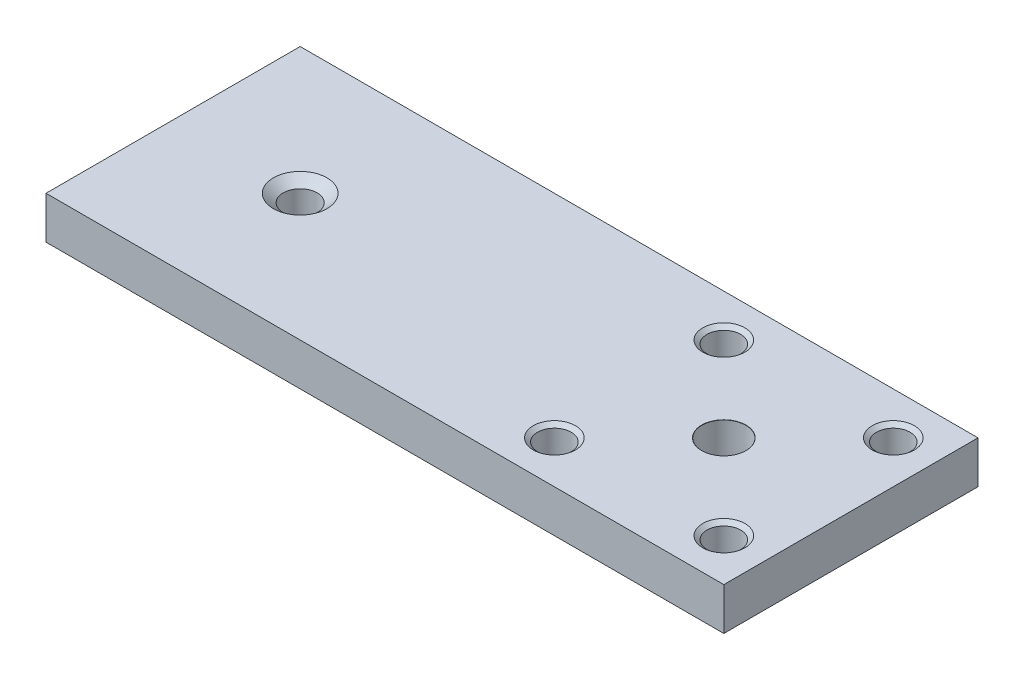
ISO-10303-21;
HEADER;
FILE_DESCRIPTION(('STEP AP214'),'2;1');
FILE_NAME('part.step','',(''),(''),'','','');
FILE_SCHEMA(('AUTOMOTIVE_DESIGN { 1 0 10303 214 1 1 1 1 }'));
ENDSEC;
DATA;
#1=APPLICATION_CONTEXT('core data for automotive mechanical design processes');
#2=APPLICATION_PROTOCOL_DEFINITION('international standard','automotive_design',2000,#1);
#3=PRODUCT_CONTEXT('',#1,'mechanical');
#4=PRODUCT('Part','Part','',(#3));
#5=PRODUCT_RELATED_PRODUCT_CATEGORY('part','',(#4));
#6=PRODUCT_DEFINITION_FORMATION('','',#4);
#7=PRODUCT_DEFINITION_CONTEXT('part definition',#1,'design');
#8=PRODUCT_DEFINITION('design','',#6,#7);
#9=PRODUCT_DEFINITION_SHAPE('','',#8);
#10=(LENGTH_UNIT() NAMED_UNIT(*) SI_UNIT(.MILLI.,.METRE.));
#11=(NAMED_UNIT(*) PLANE_ANGLE_UNIT() SI_UNIT($,.RADIAN.));
#12=(NAMED_UNIT(*) SI_UNIT($,.STERADIAN.) SOLID_ANGLE_UNIT());
#13=UNCERTAINTY_MEASURE_WITH_UNIT(LENGTH_MEASURE(1.E-05),#10,'distance_accuracy_value','');
#14=(GEOMETRIC_REPRESENTATION_CONTEXT(3) GLOBAL_UNCERTAINTY_ASSIGNED_CONTEXT((#13)) GLOBAL_UNIT_ASSIGNED_CONTEXT((#10,
#11,#12)) REPRESENTATION_CONTEXT('',''));
#15=CARTESIAN_POINT('',(0.,0.,0.));
#16=DIRECTION('',(0.,0.,1.));
#17=DIRECTION('',(1.,0.,0.));
#18=AXIS2_PLACEMENT_3D('',#15,#16,#17);
#19=CARTESIAN_POINT('',(0.,6.35,0.));
#20=DIRECTION('',(1.,0.,0.));
#21=DIRECTION('',(0.,0.,-1.));
#22=AXIS2_PLACEMENT_3D('',#19,#20,#21);
#23=PLANE('',#22);
#24=DIRECTION('',(0.,0.,1.));
#25=VECTOR('',#24,1.);
#26=CARTESIAN_POINT('',(0.,0.,0.));
#27=LINE('',#26,#25);
#28=CARTESIAN_POINT('',(0.,0.,-38.1));
#29=VERTEX_POINT('',#28);
#30=CARTESIAN_POINT('',(0.,0.,0.));
#31=VERTEX_POINT('',#30);
#32=EDGE_CURVE('E104',#29,#31,#27,.T.);
#33=ORIENTED_EDGE('',*,*,#32,.T.);
#34=DIRECTION('',(0.,-1.,0.));
#35=VECTOR('',#34,1.);
#36=CARTESIAN_POINT('',(0.,6.35,0.));
#37=LINE('',#36,#35);
#38=CARTESIAN_POINT('',(0.,6.35,0.));
#39=VERTEX_POINT('',#38);
#40=EDGE_CURVE('E11',#39,#31,#37,.T.);
#41=ORIENTED_EDGE('',*,*,#40,.F.);
#42=DIRECTION('',(0.,0.,1.));
#43=VECTOR('',#42,1.);
#44=CARTESIAN_POINT('',(0.,6.35,0.));
#45=LINE('',#44,#43);
#46=CARTESIAN_POINT('',(0.,6.35,-38.1));
#47=VERTEX_POINT('',#46);
#48=EDGE_CURVE('E92',#47,#39,#45,.T.);
#49=ORIENTED_EDGE('',*,*,#48,.F.);
#50=DIRECTION('',(0.,-1.,0.));
#51=VECTOR('',#50,1.);
#52=CARTESIAN_POINT('',(0.,6.35,-38.1));
#53=LINE('',#52,#51);
#54=EDGE_CURVE('E100',#47,#29,#53,.T.);
#55=ORIENTED_EDGE('',*,*,#54,.T.);
#56=EDGE_LOOP('',(#33,#41,#49,#55));
#57=FACE_BOUND('',#56,.T.);
#58=ADVANCED_FACE('F41',(#57),#23,.F.);
#59=CARTESIAN_POINT('',(0.,6.35,0.));
#60=DIRECTION('',(0.,0.,-1.));
#61=DIRECTION('',(-1.,0.,0.));
#62=AXIS2_PLACEMENT_3D('',#59,#60,#61);
#63=PLANE('',#62);
#64=DIRECTION('',(1.,0.,0.));
#65=VECTOR('',#64,1.);
#66=CARTESIAN_POINT('',(0.,0.,0.));
#67=LINE('',#66,#65);
#68=CARTESIAN_POINT('',(101.6,0.,0.));
#69=VERTEX_POINT('',#68);
#70=EDGE_CURVE('E96',#31,#69,#67,.T.);
#71=ORIENTED_EDGE('',*,*,#70,.T.);
#72=DIRECTION('',(0.,-1.,0.));
#73=VECTOR('',#72,1.);
#74=CARTESIAN_POINT('',(101.6,6.35,0.));
#75=LINE('',#74,#73);
#76=CARTESIAN_POINT('',(101.6,6.35,0.));
#77=VERTEX_POINT('',#76);
#78=EDGE_CURVE('E49',#77,#69,#75,.T.);
#79=ORIENTED_EDGE('',*,*,#78,.F.);
#80=DIRECTION('',(1.,0.,0.));
#81=VECTOR('',#80,1.);
#82=CARTESIAN_POINT('',(0.,6.35,0.));
#83=LINE('',#82,#81);
#84=EDGE_CURVE('E87',#39,#77,#83,.T.);
#85=ORIENTED_EDGE('',*,*,#84,.F.);
#86=ORIENTED_EDGE('',*,*,#40,.T.);
#87=EDGE_LOOP('',(#71,#79,#85,#86));
#88=FACE_BOUND('',#87,.T.);
#89=ADVANCED_FACE('F95',(#88),#63,.F.);
#90=CARTESIAN_POINT('',(101.6,6.35,0.));
#91=DIRECTION('',(-1.,0.,0.));
#92=DIRECTION('',(0.,0.,1.));
#93=AXIS2_PLACEMENT_3D('',#90,#91,#92);
#94=PLANE('',#93);
#95=DIRECTION('',(0.,0.,-1.));
#96=VECTOR('',#95,1.);
#97=CARTESIAN_POINT('',(101.6,0.,0.));
#98=LINE('',#97,#96);
#99=CARTESIAN_POINT('',(101.6,0.,-38.1));
#100=VERTEX_POINT('',#99);
#101=EDGE_CURVE('E74',#69,#100,#98,.T.);
#102=ORIENTED_EDGE('',*,*,#101,.T.);
#103=DIRECTION('',(0.,-1.,0.));
#104=VECTOR('',#103,1.);
#105=CARTESIAN_POINT('',(101.6,6.35,-38.1));
#106=LINE('',#105,#104);
#107=CARTESIAN_POINT('',(101.6,6.35,-38.1));
#108=VERTEX_POINT('',#107);
#109=EDGE_CURVE('E97',#108,#100,#106,.T.);
#110=ORIENTED_EDGE('',*,*,#109,.F.);
#111=DIRECTION('',(0.,0.,-1.));
#112=VECTOR('',#111,1.);
#113=CARTESIAN_POINT('',(101.6,6.35,0.));
#114=LINE('',#113,#112);
#115=EDGE_CURVE('E90',#77,#108,#114,.T.);
#116=ORIENTED_EDGE('',*,*,#115,.F.);
#117=ORIENTED_EDGE('',*,*,#78,.T.);
#118=EDGE_LOOP('',(#102,#110,#116,#117));
#119=FACE_BOUND('',#118,.T.);
#120=ADVANCED_FACE('F98',(#119),#94,.F.);
#121=CARTESIAN_POINT('',(0.,6.35,-38.1));
#122=DIRECTION('',(0.,0.,1.));
#123=DIRECTION('',(1.,0.,0.));
#124=AXIS2_PLACEMENT_3D('',#121,#122,#123);
#125=PLANE('',#124);
#126=DIRECTION('',(-1.,0.,0.));
#127=VECTOR('',#126,1.);
#128=CARTESIAN_POINT('',(0.,0.,-38.1));
#129=LINE('',#128,#127);
#130=EDGE_CURVE('E80',#100,#29,#129,.T.);
#131=ORIENTED_EDGE('',*,*,#130,.T.);
#132=ORIENTED_EDGE('',*,*,#54,.F.);
#133=DIRECTION('',(-1.,0.,0.));
#134=VECTOR('',#133,1.);
#135=CARTESIAN_POINT('',(0.,6.35,-38.1));
#136=LINE('',#135,#134);
#137=EDGE_CURVE('E57',#108,#47,#136,.T.);
#138=ORIENTED_EDGE('',*,*,#137,.F.);
#139=ORIENTED_EDGE('',*,*,#109,.T.);
#140=EDGE_LOOP('',(#131,#132,#138,#139));
#141=FACE_BOUND('',#140,.T.);
#142=ADVANCED_FACE('F112',(#141),#125,.F.);
#143=CARTESIAN_POINT('',(0.,6.35,0.));
#144=DIRECTION('',(0.,-1.,0.));
#145=DIRECTION('',(0.,0.,-1.));
#146=AXIS2_PLACEMENT_3D('',#143,#144,#145);
#147=PLANE('',#146);
#148=CARTESIAN_POINT('',(95.25,6.35,-31.75));
#149=DIRECTION('',(0.,1.,0.));
#150=DIRECTION('',(0.,0.,1.));
#151=AXIS2_PLACEMENT_3D('',#148,#149,#150);
#152=CIRCLE('',#151,3.16230000000001);
#153=CARTESIAN_POINT('',(95.25,6.35,-28.5877));
#154=VERTEX_POINT('',#153);
#155=EDGE_CURVE('E168',#154,#154,#152,.T.);
#156=ORIENTED_EDGE('',*,*,#155,.F.);
#157=EDGE_LOOP('',(#156));
#158=FACE_BOUND('',#157,.T.);
#159=CARTESIAN_POINT('',(69.85,6.35,-31.75));
#160=DIRECTION('',(0.,1.,0.));
#161=DIRECTION('',(0.,0.,1.));
#162=AXIS2_PLACEMENT_3D('',#159,#160,#161);
#163=CIRCLE('',#162,3.16230000000001);
#164=CARTESIAN_POINT('',(69.85,6.35,-28.5877));
#165=VERTEX_POINT('',#164);
#166=EDGE_CURVE('E159',#165,#165,#163,.T.);
#167=ORIENTED_EDGE('',*,*,#166,.F.);
#168=EDGE_LOOP('',(#167));
#169=FACE_BOUND('',#168,.T.);
#170=CARTESIAN_POINT('',(69.85,6.35,-6.35));
#171=DIRECTION('',(0.,1.,0.));
#172=DIRECTION('',(0.,0.,1.));
#173=AXIS2_PLACEMENT_3D('',#170,#171,#172);
#174=CIRCLE('',#173,3.16230000000001);
#175=CARTESIAN_POINT('',(69.85,6.35,-3.18769999999999));
#176=VERTEX_POINT('',#175);
#177=EDGE_CURVE('E150',#176,#176,#174,.T.);
#178=ORIENTED_EDGE('',*,*,#177,.F.);
#179=EDGE_LOOP('',(#178));
#180=FACE_BOUND('',#179,.T.);
#181=CARTESIAN_POINT('',(95.25,6.35,-6.35));
#182=DIRECTION('',(0.,1.,0.));
#183=DIRECTION('',(0.,0.,1.));
#184=AXIS2_PLACEMENT_3D('',#181,#182,#183);
#185=CIRCLE('',#184,3.16229999999999);
#186=CARTESIAN_POINT('',(95.25,6.35,-3.18770000000001));
#187=VERTEX_POINT('',#186);
#188=EDGE_CURVE('E141',#187,#187,#185,.T.);
#189=ORIENTED_EDGE('',*,*,#188,.F.);
#190=EDGE_LOOP('',(#189));
#191=FACE_BOUND('',#190,.T.);
#192=CARTESIAN_POINT('',(82.55,6.35,-19.05));
#193=DIRECTION('',(0.,1.,0.));
#194=DIRECTION('',(0.,0.,1.));
#195=AXIS2_PLACEMENT_3D('',#192,#193,#194);
#196=CIRCLE('',#195,3.32499999999999);
#197=CARTESIAN_POINT('',(82.55,6.35,-15.725));
#198=VERTEX_POINT('',#197);
#199=EDGE_CURVE('E132',#198,#198,#196,.T.);
#200=ORIENTED_EDGE('',*,*,#199,.F.);
#201=EDGE_LOOP('',(#200));
#202=FACE_BOUND('',#201,.T.);
#203=CARTESIAN_POINT('',(19.05,6.35,-19.05));
#204=DIRECTION('',(0.,1.,0.));
#205=DIRECTION('',(0.,0.,1.));
#206=AXIS2_PLACEMENT_3D('',#203,#204,#205);
#207=CIRCLE('',#206,4.0132);
#208=CARTESIAN_POINT('',(19.05,6.35,-15.0368));
#209=VERTEX_POINT('',#208);
#210=EDGE_CURVE('E123',#209,#209,#207,.T.);
#211=ORIENTED_EDGE('',*,*,#210,.F.);
#212=EDGE_LOOP('',(#211));
#213=FACE_BOUND('',#212,.T.);
#214=ORIENTED_EDGE('',*,*,#48,.T.);
#215=ORIENTED_EDGE('',*,*,#84,.T.);
#216=ORIENTED_EDGE('',*,*,#115,.T.);
#217=ORIENTED_EDGE('',*,*,#137,.T.);
#218=EDGE_LOOP('',(#214,#215,#216,#217));
#219=FACE_BOUND('',#218,.T.);
#220=ADVANCED_FACE('F88',(#158,#169,#180,#191,#202,#213,#219),#147,.F.);
#221=CARTESIAN_POINT('',(0.,0.,0.));
#222=DIRECTION('',(0.,-1.,0.));
#223=DIRECTION('',(0.,0.,-1.));
#224=AXIS2_PLACEMENT_3D('',#221,#222,#223);
#225=PLANE('',#224);
#226=CARTESIAN_POINT('',(95.25,0.,-31.75));
#227=DIRECTION('',(0.,1.,0.));
#228=DIRECTION('',(0.,0.,1.));
#229=AXIS2_PLACEMENT_3D('',#226,#227,#228);
#230=CIRCLE('',#229,2.5273);
#231=CARTESIAN_POINT('',(95.25,0.,-29.2227));
#232=VERTEX_POINT('',#231);
#233=EDGE_CURVE('E162',#232,#232,#230,.T.);
#234=ORIENTED_EDGE('',*,*,#233,.T.);
#235=EDGE_LOOP('',(#234));
#236=FACE_BOUND('',#235,.T.);
#237=CARTESIAN_POINT('',(69.85,0.,-31.75));
#238=DIRECTION('',(0.,1.,0.));
#239=DIRECTION('',(0.,0.,1.));
#240=AXIS2_PLACEMENT_3D('',#237,#238,#239);
#241=CIRCLE('',#240,2.5273);
#242=CARTESIAN_POINT('',(69.85,0.,-29.2227));
#243=VERTEX_POINT('',#242);
#244=EDGE_CURVE('E153',#243,#243,#241,.T.);
#245=ORIENTED_EDGE('',*,*,#244,.T.);
#246=EDGE_LOOP('',(#245));
#247=FACE_BOUND('',#246,.T.);
#248=CARTESIAN_POINT('',(69.85,0.,-6.35));
#249=DIRECTION('',(0.,1.,0.));
#250=DIRECTION('',(0.,0.,1.));
#251=AXIS2_PLACEMENT_3D('',#248,#249,#250);
#252=CIRCLE('',#251,2.5273);
#253=CARTESIAN_POINT('',(69.85,0.,-3.8227));
#254=VERTEX_POINT('',#253);
#255=EDGE_CURVE('E144',#254,#254,#252,.T.);
#256=ORIENTED_EDGE('',*,*,#255,.T.);
#257=EDGE_LOOP('',(#256));
#258=FACE_BOUND('',#257,.T.);
#259=CARTESIAN_POINT('',(95.25,0.,-6.35));
#260=DIRECTION('',(0.,1.,0.));
#261=DIRECTION('',(0.,0.,1.));
#262=AXIS2_PLACEMENT_3D('',#259,#260,#261);
#263=CIRCLE('',#262,2.5273);
#264=CARTESIAN_POINT('',(95.25,0.,-3.8227));
#265=VERTEX_POINT('',#264);
#266=EDGE_CURVE('E135',#265,#265,#263,.T.);
#267=ORIENTED_EDGE('',*,*,#266,.T.);
#268=EDGE_LOOP('',(#267));
#269=FACE_BOUND('',#268,.T.);
#270=CARTESIAN_POINT('',(82.55,0.,-19.05));
#271=DIRECTION('',(0.,1.,0.));
#272=DIRECTION('',(0.,0.,1.));
#273=AXIS2_PLACEMENT_3D('',#270,#271,#272);
#274=CIRCLE('',#273,3.3);
#275=CARTESIAN_POINT('',(82.55,0.,-15.75));
#276=VERTEX_POINT('',#275);
#277=EDGE_CURVE('E126',#276,#276,#274,.T.);
#278=ORIENTED_EDGE('',*,*,#277,.T.);
#279=EDGE_LOOP('',(#278));
#280=FACE_BOUND('',#279,.T.);
#281=CARTESIAN_POINT('',(19.05,0.,-19.05));
#282=DIRECTION('',(0.,1.,0.));
#283=DIRECTION('',(0.,0.,1.));
#284=AXIS2_PLACEMENT_3D('',#281,#282,#283);
#285=CIRCLE('',#284,2.5527);
#286=CARTESIAN_POINT('',(19.05,0.,-16.4973));
#287=VERTEX_POINT('',#286);
#288=EDGE_CURVE('E107',#287,#287,#285,.T.);
#289=ORIENTED_EDGE('',*,*,#288,.T.);
#290=EDGE_LOOP('',(#289));
#291=FACE_BOUND('',#290,.T.);
#292=ORIENTED_EDGE('',*,*,#32,.F.);
#293=ORIENTED_EDGE('',*,*,#130,.F.);
#294=ORIENTED_EDGE('',*,*,#101,.F.);
#295=ORIENTED_EDGE('',*,*,#70,.F.);
#296=EDGE_LOOP('',(#292,#293,#294,#295));
#297=FACE_BOUND('',#296,.T.);
#298=ADVANCED_FACE('F115',(#236,#247,#258,#269,#280,#291,#297),#225,.T.);
#299=CARTESIAN_POINT('',(19.05,6.35,-19.05));
#300=DIRECTION('',(0.,1.,0.));
#301=DIRECTION('',(0.,0.,1.));
#302=AXIS2_PLACEMENT_3D('',#299,#300,#301);
#303=CYLINDRICAL_SURFACE('',#302,2.5527);
#304=ORIENTED_EDGE('',*,*,#288,.F.);
#305=EDGE_LOOP('',(#304));
#306=FACE_BOUND('',#305,.T.);
#307=CARTESIAN_POINT('',(19.05,5.12449498866558,-19.05));
#308=DIRECTION('',(0.,1.,0.));
#309=DIRECTION('',(0.,0.,1.));
#310=AXIS2_PLACEMENT_3D('',#307,#308,#309);
#311=CIRCLE('',#310,2.5527);
#312=CARTESIAN_POINT('',(19.05,5.12449498866558,-16.4973));
#313=VERTEX_POINT('',#312);
#314=EDGE_CURVE('E120',#313,#313,#311,.T.);
#315=ORIENTED_EDGE('',*,*,#314,.T.);
#316=EDGE_LOOP('',(#315));
#317=FACE_BOUND('',#316,.T.);
#318=ADVANCED_FACE('F190',(#306,#317),#303,.F.);
#319=CARTESIAN_POINT('',(19.05,6.35,-19.05));
#320=DIRECTION('',(0.,1.,0.));
#321=DIRECTION('',(0.,0.,1.));
#322=AXIS2_PLACEMENT_3D('',#319,#320,#321);
#323=CONICAL_SURFACE('',#322,4.0132,0.872664625997165);
#324=ORIENTED_EDGE('',*,*,#314,.F.);
#325=EDGE_LOOP('',(#324));
#326=FACE_BOUND('',#325,.T.);
#327=ORIENTED_EDGE('',*,*,#210,.T.);
#328=EDGE_LOOP('',(#327));
#329=FACE_BOUND('',#328,.T.);
#330=ADVANCED_FACE('F187',(#326,#329),#323,.F.);
#331=CARTESIAN_POINT('',(82.55,6.35,-19.05));
#332=DIRECTION('',(0.,1.,0.));
#333=DIRECTION('',(0.,0.,1.));
#334=AXIS2_PLACEMENT_3D('',#331,#332,#333);
#335=CYLINDRICAL_SURFACE('',#334,3.3);
#336=ORIENTED_EDGE('',*,*,#277,.F.);
#337=EDGE_LOOP('',(#336));
#338=FACE_BOUND('',#337,.T.);
#339=CARTESIAN_POINT('',(82.55,6.32902250922057,-19.05));
#340=DIRECTION('',(0.,1.,0.));
#341=DIRECTION('',(0.,0.,1.));
#342=AXIS2_PLACEMENT_3D('',#339,#340,#341);
#343=CIRCLE('',#342,3.3);
#344=CARTESIAN_POINT('',(82.55,6.32902250922057,-15.75));
#345=VERTEX_POINT('',#344);
#346=EDGE_CURVE('E129',#345,#345,#343,.T.);
#347=ORIENTED_EDGE('',*,*,#346,.T.);
#348=EDGE_LOOP('',(#347));
#349=FACE_BOUND('',#348,.T.);
#350=ADVANCED_FACE('F189',(#338,#349),#335,.F.);
#351=CARTESIAN_POINT('',(82.55,6.35,-19.05));
#352=DIRECTION('',(0.,1.,0.));
#353=DIRECTION('',(0.,0.,1.));
#354=AXIS2_PLACEMENT_3D('',#351,#352,#353);
#355=CONICAL_SURFACE('',#354,3.32499999999999,0.87266462599709);
#356=ORIENTED_EDGE('',*,*,#346,.F.);
#357=EDGE_LOOP('',(#356));
#358=FACE_BOUND('',#357,.T.);
#359=ORIENTED_EDGE('',*,*,#199,.T.);
#360=EDGE_LOOP('',(#359));
#361=FACE_BOUND('',#360,.T.);
#362=ADVANCED_FACE('F197',(#358,#361),#355,.F.);
#363=CARTESIAN_POINT('',(95.25,6.35,-6.35));
#364=DIRECTION('',(0.,1.,0.));
#365=DIRECTION('',(0.,0.,1.));
#366=AXIS2_PLACEMENT_3D('',#363,#364,#365);
#367=CYLINDRICAL_SURFACE('',#366,2.5273);
#368=ORIENTED_EDGE('',*,*,#266,.F.);
#369=EDGE_LOOP('',(#368));
#370=FACE_BOUND('',#369,.T.);
#371=CARTESIAN_POINT('',(95.25,5.81717173420243,-6.35));
#372=DIRECTION('',(0.,1.,0.));
#373=DIRECTION('',(0.,0.,1.));
#374=AXIS2_PLACEMENT_3D('',#371,#372,#373);
#375=CIRCLE('',#374,2.5273);
#376=CARTESIAN_POINT('',(95.25,5.81717173420243,-3.8227));
#377=VERTEX_POINT('',#376);
#378=EDGE_CURVE('E138',#377,#377,#375,.T.);
#379=ORIENTED_EDGE('',*,*,#378,.T.);
#380=EDGE_LOOP('',(#379));
#381=FACE_BOUND('',#380,.T.);
#382=ADVANCED_FACE('F235',(#370,#381),#367,.F.);
#383=CARTESIAN_POINT('',(95.25,6.35,-6.35));
#384=DIRECTION('',(0.,1.,0.));
#385=DIRECTION('',(0.,0.,1.));
#386=AXIS2_PLACEMENT_3D('',#383,#384,#385);
#387=CONICAL_SURFACE('',#386,3.16229999999999,0.872664625997163);
#388=ORIENTED_EDGE('',*,*,#378,.F.);
#389=EDGE_LOOP('',(#388));
#390=FACE_BOUND('',#389,.T.);
#391=ORIENTED_EDGE('',*,*,#188,.T.);
#392=EDGE_LOOP('',(#391));
#393=FACE_BOUND('',#392,.T.);
#394=ADVANCED_FACE('F240',(#390,#393),#387,.F.);
#395=CARTESIAN_POINT('',(69.85,6.35,-6.35));
#396=DIRECTION('',(0.,1.,0.));
#397=DIRECTION('',(0.,0.,1.));
#398=AXIS2_PLACEMENT_3D('',#395,#396,#397);
#399=CYLINDRICAL_SURFACE('',#398,2.5273);
#400=ORIENTED_EDGE('',*,*,#255,.F.);
#401=EDGE_LOOP('',(#400));
#402=FACE_BOUND('',#401,.T.);
#403=CARTESIAN_POINT('',(69.85,5.81717173420243,-6.35));
#404=DIRECTION('',(0.,1.,0.));
#405=DIRECTION('',(0.,0.,1.));
#406=AXIS2_PLACEMENT_3D('',#403,#404,#405);
#407=CIRCLE('',#406,2.5273);
#408=CARTESIAN_POINT('',(69.85,5.81717173420243,-3.8227));
#409=VERTEX_POINT('',#408);
#410=EDGE_CURVE('E147',#409,#409,#407,.T.);
#411=ORIENTED_EDGE('',*,*,#410,.T.);
#412=EDGE_LOOP('',(#411));
#413=FACE_BOUND('',#412,.T.);
#414=ADVANCED_FACE('F246',(#402,#413),#399,.F.);
#415=CARTESIAN_POINT('',(69.85,6.35,-6.35));
#416=DIRECTION('',(0.,1.,0.));
#417=DIRECTION('',(0.,0.,1.));
#418=AXIS2_PLACEMENT_3D('',#415,#416,#417);
#419=CONICAL_SURFACE('',#418,3.16230000000001,0.872664625997173);
#420=ORIENTED_EDGE('',*,*,#410,.F.);
#421=EDGE_LOOP('',(#420));
#422=FACE_BOUND('',#421,.T.);
#423=ORIENTED_EDGE('',*,*,#177,.T.);
#424=EDGE_LOOP('',(#423));
#425=FACE_BOUND('',#424,.T.);
#426=ADVANCED_FACE('F250',(#422,#425),#419,.F.);
#427=CARTESIAN_POINT('',(69.85,6.35,-31.75));
#428=DIRECTION('',(0.,1.,0.));
#429=DIRECTION('',(0.,0.,1.));
#430=AXIS2_PLACEMENT_3D('',#427,#428,#429);
#431=CYLINDRICAL_SURFACE('',#430,2.5273);
#432=ORIENTED_EDGE('',*,*,#244,.F.);
#433=EDGE_LOOP('',(#432));
#434=FACE_BOUND('',#433,.T.);
#435=CARTESIAN_POINT('',(69.85,5.81717173420243,-31.75));
#436=DIRECTION('',(0.,1.,0.));
#437=DIRECTION('',(0.,0.,1.));
#438=AXIS2_PLACEMENT_3D('',#435,#436,#437);
#439=CIRCLE('',#438,2.5273);
#440=CARTESIAN_POINT('',(69.85,5.81717173420243,-29.2227));
#441=VERTEX_POINT('',#440);
#442=EDGE_CURVE('E156',#441,#441,#439,.T.);
#443=ORIENTED_EDGE('',*,*,#442,.T.);
#444=EDGE_LOOP('',(#443));
#445=FACE_BOUND('',#444,.T.);
#446=ADVANCED_FACE('F254',(#434,#445),#431,.F.);
#447=CARTESIAN_POINT('',(69.85,6.35,-31.75));
#448=DIRECTION('',(0.,1.,0.));
#449=DIRECTION('',(0.,0.,1.));
#450=AXIS2_PLACEMENT_3D('',#447,#448,#449);
#451=CONICAL_SURFACE('',#450,3.16230000000001,0.872664625997173);
#452=ORIENTED_EDGE('',*,*,#442,.F.);
#453=EDGE_LOOP('',(#452));
#454=FACE_BOUND('',#453,.T.);
#455=ORIENTED_EDGE('',*,*,#166,.T.);
#456=EDGE_LOOP('',(#455));
#457=FACE_BOUND('',#456,.T.);
#458=ADVANCED_FACE('F258',(#454,#457),#451,.F.);
#459=CARTESIAN_POINT('',(95.25,6.35,-31.75));
#460=DIRECTION('',(0.,1.,0.));
#461=DIRECTION('',(0.,0.,1.));
#462=AXIS2_PLACEMENT_3D('',#459,#460,#461);
#463=CYLINDRICAL_SURFACE('',#462,2.5273);
#464=ORIENTED_EDGE('',*,*,#233,.F.);
#465=EDGE_LOOP('',(#464));
#466=FACE_BOUND('',#465,.T.);
#467=CARTESIAN_POINT('',(95.25,5.81717173420243,-31.75));
#468=DIRECTION('',(0.,1.,0.));
#469=DIRECTION('',(0.,0.,1.));
#470=AXIS2_PLACEMENT_3D('',#467,#468,#469);
#471=CIRCLE('',#470,2.5273);
#472=CARTESIAN_POINT('',(95.25,5.81717173420243,-29.2227));
#473=VERTEX_POINT('',#472);
#474=EDGE_CURVE('E165',#473,#473,#471,.T.);
#475=ORIENTED_EDGE('',*,*,#474,.T.);
#476=EDGE_LOOP('',(#475));
#477=FACE_BOUND('',#476,.T.);
#478=ADVANCED_FACE('F262',(#466,#477),#463,.F.);
#479=CARTESIAN_POINT('',(95.25,6.35,-31.75));
#480=DIRECTION('',(0.,1.,0.));
#481=DIRECTION('',(0.,0.,1.));
#482=AXIS2_PLACEMENT_3D('',#479,#480,#481);
#483=CONICAL_SURFACE('',#482,3.16230000000001,0.872664625997173);
#484=ORIENTED_EDGE('',*,*,#474,.F.);
#485=EDGE_LOOP('',(#484));
#486=FACE_BOUND('',#485,.T.);
#487=ORIENTED_EDGE('',*,*,#155,.T.);
#488=EDGE_LOOP('',(#487));
#489=FACE_BOUND('',#488,.T.);
#490=ADVANCED_FACE('F172',(#486,#489),#483,.F.);
#491=CLOSED_SHELL('',(#58,#89,#120,#142,#220,#298,#318,#330,#350,#362,#382,#394,#414,#426,#446,
#458,#478,#490));
#492=MANIFOLD_SOLID_BREP('B2',#491);
#493=ADVANCED_BREP_SHAPE_REPRESENTATION('',(#18,#492),#14);
#494=SHAPE_DEFINITION_REPRESENTATION(#9,#493);
ENDSEC;
END-ISO-10303-21;
